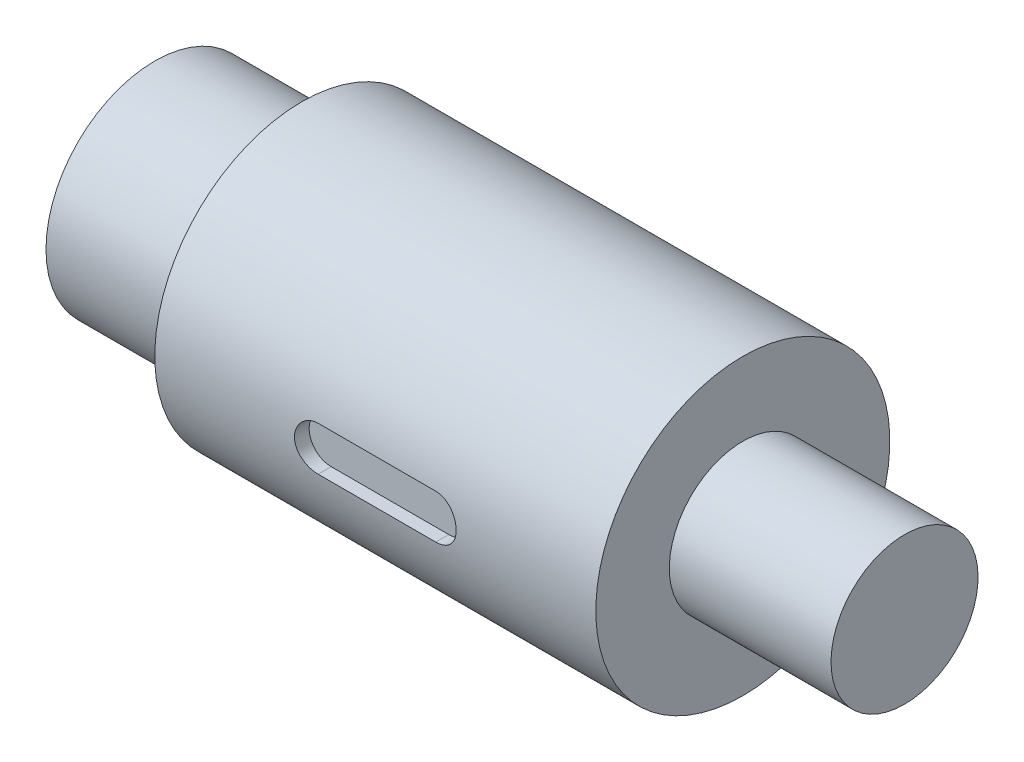
ISO-10303-21;
HEADER;
FILE_DESCRIPTION(('STEP AP214'),'2;1');
FILE_NAME('part.step','',(''),(''),'','','');
FILE_SCHEMA(('AUTOMOTIVE_DESIGN { 1 0 10303 214 1 1 1 1 }'));
ENDSEC;
DATA;
#1=APPLICATION_CONTEXT('core data for automotive mechanical design processes');
#2=APPLICATION_PROTOCOL_DEFINITION('international standard','automotive_design',2000,#1);
#3=PRODUCT_CONTEXT('',#1,'mechanical');
#4=PRODUCT('Part','Part','',(#3));
#5=PRODUCT_RELATED_PRODUCT_CATEGORY('part','',(#4));
#6=PRODUCT_DEFINITION_FORMATION('','',#4);
#7=PRODUCT_DEFINITION_CONTEXT('part definition',#1,'design');
#8=PRODUCT_DEFINITION('design','',#6,#7);
#9=PRODUCT_DEFINITION_SHAPE('','',#8);
#10=(LENGTH_UNIT() NAMED_UNIT(*) SI_UNIT(.MILLI.,.METRE.));
#11=(NAMED_UNIT(*) PLANE_ANGLE_UNIT() SI_UNIT($,.RADIAN.));
#12=(NAMED_UNIT(*) SI_UNIT($,.STERADIAN.) SOLID_ANGLE_UNIT());
#13=UNCERTAINTY_MEASURE_WITH_UNIT(LENGTH_MEASURE(1.E-05),#10,'distance_accuracy_value','');
#14=(GEOMETRIC_REPRESENTATION_CONTEXT(3) GLOBAL_UNCERTAINTY_ASSIGNED_CONTEXT((#13)) GLOBAL_UNIT_ASSIGNED_CONTEXT((#10,
#11,#12)) REPRESENTATION_CONTEXT('',''));
#15=CARTESIAN_POINT('',(0.,0.,0.));
#16=DIRECTION('',(0.,0.,1.));
#17=DIRECTION('',(1.,0.,0.));
#18=AXIS2_PLACEMENT_3D('',#15,#16,#17);
#19=CARTESIAN_POINT('',(0.,0.,0.));
#20=DIRECTION('',(-1.,0.,0.));
#21=DIRECTION('',(0.,-1.,0.));
#22=AXIS2_PLACEMENT_3D('',#19,#20,#21);
#23=CYLINDRICAL_SURFACE('',#22,10.);
#24=CARTESIAN_POINT('',(40.,0.,0.));
#25=DIRECTION('',(-1.,0.,0.));
#26=DIRECTION('',(0.,-1.,0.));
#27=AXIS2_PLACEMENT_3D('',#24,#25,#26);
#28=CIRCLE('',#27,10.);
#29=CARTESIAN_POINT('',(40.,-10.,0.));
#30=VERTEX_POINT('',#29);
#31=EDGE_CURVE('E133',#30,#30,#28,.T.);
#32=ORIENTED_EDGE('',*,*,#31,.T.);
#33=EDGE_LOOP('',(#32));
#34=FACE_BOUND('',#33,.T.);
#35=CARTESIAN_POINT('',(10.,0.,0.));
#36=DIRECTION('',(-1.,0.,0.));
#37=DIRECTION('',(0.,-1.,0.));
#38=AXIS2_PLACEMENT_3D('',#35,#36,#37);
#39=CIRCLE('',#38,10.);
#40=CARTESIAN_POINT('',(10.,-10.,0.));
#41=VERTEX_POINT('',#40);
#42=EDGE_CURVE('E137',#41,#41,#39,.T.);
#43=ORIENTED_EDGE('',*,*,#42,.F.);
#44=EDGE_LOOP('',(#43));
#45=FACE_BOUND('',#44,.T.);
#46=CARTESIAN_POINT('',(21.,1.5,9.88685996664259));
#47=CARTESIAN_POINT('',(20.9580518202284,1.50000000266732,9.88685840785077));
#48=CARTESIAN_POINT('',(20.9161239716696,1.49823923973863,9.88712727473813));
#49=CARTESIAN_POINT('',(20.8325729919536,1.49121669464497,9.88818949187884));
#50=CARTESIAN_POINT('',(20.7909498337063,1.48595522764718,9.88898279491733));
#51=CARTESIAN_POINT('',(20.6670918819678,1.46497881750098,9.89212058297808));
#52=CARTESIAN_POINT('',(20.5856941728406,1.44407166865904,9.89522307907874));
#53=CARTESIAN_POINT('',(20.4276160400256,1.38902615352525,9.90309898933595));
#54=CARTESIAN_POINT('',(20.3509368797062,1.35488426140282,9.90787284872281));
#55=CARTESIAN_POINT('',(20.2043846840671,1.27435597412008,9.91855133175475));
#56=CARTESIAN_POINT('',(20.1345114690497,1.22796990236328,9.92445592553278));
#57=CARTESIAN_POINT('',(20.003018343427,1.12388153164428,9.93678257695107));
#58=CARTESIAN_POINT('',(19.9414601330534,1.06610171081972,9.94320799119173));
#59=CARTESIAN_POINT('',(19.8288678084724,0.941026215278604,9.95582307783248));
#60=CARTESIAN_POINT('',(19.7778353026265,0.873729088931482,9.9620127140873));
#61=CARTESIAN_POINT('',(19.6875219740596,0.731134276552847,9.97349364061962));
#62=CARTESIAN_POINT('',(19.6482985520619,0.655799848412228,9.9787804905557));
#63=CARTESIAN_POINT('',(19.5830869108457,0.499524151714074,9.98782228654626));
#64=CARTESIAN_POINT('',(19.5570972267437,0.418583504853573,9.991577402144));
#65=CARTESIAN_POINT('',(19.5192768330848,0.254032109539508,9.99710911461993));
#66=CARTESIAN_POINT('',(19.5073415576171,0.170445893373183,9.99890031620178));
#67=CARTESIAN_POINT('',(19.4976440141637,0.00243723131435115,10.0003524554738));
#68=CARTESIAN_POINT('',(19.4998812975124,-0.0819851880217101,10.0000134606003));
#69=CARTESIAN_POINT('',(19.5183833632824,-0.248551967983507,9.99725499253034));
#70=CARTESIAN_POINT('',(19.5345352628208,-0.330709184196646,9.99485226193999));
#71=CARTESIAN_POINT('',(19.5802307890995,-0.491133297591266,9.98825497732616));
#72=CARTESIAN_POINT('',(19.6097746805602,-0.569400117837079,9.98406038788298));
#73=CARTESIAN_POINT('',(19.6815316823409,-0.720165267893389,9.97432184229562));
#74=CARTESIAN_POINT('',(19.7237925463523,-0.792640528207519,9.96877281518181));
#75=CARTESIAN_POINT('',(19.8197474036781,-0.929510459057296,9.95694413507246));
#76=CARTESIAN_POINT('',(19.8734416995637,-0.993904915673109,9.95066446274332));
#77=CARTESIAN_POINT('',(19.9913597147132,-1.11344594750422,9.93800248160563));
#78=CARTESIAN_POINT('',(20.0556806240439,-1.16849664126589,9.93161976829432));
#79=CARTESIAN_POINT('',(20.1927216143761,-1.26705366225889,9.9195286802005));
#80=CARTESIAN_POINT('',(20.2654441214946,-1.31055664285508,9.91382050116966));
#81=CARTESIAN_POINT('',(20.41733398012,-1.38479611633514,9.90372408744827));
#82=CARTESIAN_POINT('',(20.4965099305947,-1.41551523132484,9.89933765170366));
#83=CARTESIAN_POINT('',(20.6589222567288,-1.46314856731708,9.89241049501753));
#84=CARTESIAN_POINT('',(20.7421523456687,-1.48008348376203,9.88986700772656));
#85=CARTESIAN_POINT('',(20.8550006632408,-1.49326003326035,9.88788045186338));
#86=CARTESIAN_POINT('',(20.8839672253027,-1.49578864223619,9.88749808040955));
#87=CARTESIAN_POINT('',(20.9419516924164,-1.49915639690531,9.88698811323233));
#88=CARTESIAN_POINT('',(20.9709694287001,-1.49999838230593,9.88686008927622));
#89=CARTESIAN_POINT('',(21.,-1.5,9.88685996664259));
#90=B_SPLINE_CURVE_WITH_KNOTS('',3,(#46,#47,#48,#49,#50,#51,#52,#53,#54,#55,#56,#57,#58,#59,#60,
#61,#62,#63,#64,#65,#66,#67,#68,#69,#70,#71,#72,#73,#74,#75,#76,#77,#78,#79,#80,#81,#82,#83,#84,
#85,#86,#87,#88,#89),.UNSPECIFIED.,.F.,.F.,(4,2,2,2,2,2,2,2,2,2,2,2,2,2,2,2,2,2,2,2,2,4),(0.,
0.125766490239527,0.251521659296977,0.502515401757197,0.753576056756899,1.00463008119644,
1.25745516590775,1.51031885453268,1.76439250557207,2.01843802629312,2.27058124023081,
2.52271647202458,2.77282530444896,3.02293908100775,3.27400403904697,3.52507564202535,
3.77858546479491,4.03216867706423,4.28609548338277,4.53964033991603,4.62684087345504,
4.7138944667809),.UNSPECIFIED.);
#91=CARTESIAN_POINT('',(21.,1.5,9.88685996664259));
#92=VERTEX_POINT('',#91);
#93=CARTESIAN_POINT('',(21.,-1.5,9.88685996664259));
#94=VERTEX_POINT('',#93);
#95=EDGE_CURVE('E11',#92,#94,#90,.T.);
#96=ORIENTED_EDGE('',*,*,#95,.F.);
#97=DIRECTION('',(-1.,0.,0.));
#98=VECTOR('',#97,1.);
#99=CARTESIAN_POINT('',(0.,1.5,9.88685996664259));
#100=LINE('',#99,#98);
#101=CARTESIAN_POINT('',(29.,1.5,9.88685996664259));
#102=VERTEX_POINT('',#101);
#103=EDGE_CURVE('E149',#102,#92,#100,.T.);
#104=ORIENTED_EDGE('',*,*,#103,.F.);
#105=CARTESIAN_POINT('',(29.,-1.5,9.88685996664259));
#106=CARTESIAN_POINT('',(29.0419481797716,-1.50000000266732,9.88685840785077));
#107=CARTESIAN_POINT('',(29.0838760283304,-1.49823923973863,9.88712727473813));
#108=CARTESIAN_POINT('',(29.1674270080464,-1.49121669464497,9.88818949187884));
#109=CARTESIAN_POINT('',(29.2090501662937,-1.48595522764718,9.88898279491733));
#110=CARTESIAN_POINT('',(29.3329081180322,-1.46497881750098,9.89212058297808));
#111=CARTESIAN_POINT('',(29.4143058271594,-1.44407166865905,9.89522307907874));
#112=CARTESIAN_POINT('',(29.5723839599744,-1.38902615352525,9.90309898933595));
#113=CARTESIAN_POINT('',(29.6490631202938,-1.35488426140282,9.90787284872281));
#114=CARTESIAN_POINT('',(29.7956153159329,-1.27435597412008,9.91855133175475));
#115=CARTESIAN_POINT('',(29.8654885309503,-1.22796990236328,9.92445592553278));
#116=CARTESIAN_POINT('',(29.996981656573,-1.12388153164428,9.93678257695107));
#117=CARTESIAN_POINT('',(30.0585398669466,-1.06610171081972,9.94320799119173));
#118=CARTESIAN_POINT('',(30.1711321915276,-0.941026215278605,9.95582307783248));
#119=CARTESIAN_POINT('',(30.2221646973735,-0.873729088931482,9.9620127140873));
#120=CARTESIAN_POINT('',(30.3124780259404,-0.731134276552847,9.97349364061962));
#121=CARTESIAN_POINT('',(30.3517014479381,-0.655799848412228,9.9787804905557));
#122=CARTESIAN_POINT('',(30.4169130891543,-0.499524151714073,9.98782228654626));
#123=CARTESIAN_POINT('',(30.4429027732563,-0.418583504853573,9.991577402144));
#124=CARTESIAN_POINT('',(30.4807231669152,-0.254032109539508,9.99710911461993));
#125=CARTESIAN_POINT('',(30.4926584423829,-0.170445893373183,9.99890031620178));
#126=CARTESIAN_POINT('',(30.5023559858363,-0.00243723131435101,10.0003524554738));
#127=CARTESIAN_POINT('',(30.5001187024876,0.0819851880217102,10.0000134606003));
#128=CARTESIAN_POINT('',(30.4816166367176,0.248551967983507,9.99725499253034));
#129=CARTESIAN_POINT('',(30.4654647371792,0.330709184196646,9.99485226193999));
#130=CARTESIAN_POINT('',(30.4197692109005,0.491133297591266,9.98825497732616));
#131=CARTESIAN_POINT('',(30.3902253194398,0.56940011783708,9.98406038788298));
#132=CARTESIAN_POINT('',(30.3184683176591,0.720165267893389,9.97432184229562));
#133=CARTESIAN_POINT('',(30.2762074536477,0.79264052820752,9.96877281518181));
#134=CARTESIAN_POINT('',(30.1802525963219,0.929510459057296,9.95694413507246));
#135=CARTESIAN_POINT('',(30.1265583004363,0.993904915673109,9.95066446274332));
#136=CARTESIAN_POINT('',(30.0086402852868,1.11344594750422,9.93800248160563));
#137=CARTESIAN_POINT('',(29.9443193759561,1.16849664126589,9.93161976829432));
#138=CARTESIAN_POINT('',(29.8072783856239,1.26705366225889,9.9195286802005));
#139=CARTESIAN_POINT('',(29.7345558785054,1.31055664285508,9.91382050116966));
#140=CARTESIAN_POINT('',(29.58266601988,1.38479611633514,9.90372408744827));
#141=CARTESIAN_POINT('',(29.5034900694053,1.41551523132484,9.89933765170366));
#142=CARTESIAN_POINT('',(29.3410777432712,1.46314856731708,9.89241049501753));
#143=CARTESIAN_POINT('',(29.2578476543313,1.48008348376203,9.88986700772656));
#144=CARTESIAN_POINT('',(29.1449993367592,1.49326003326035,9.88788045186338));
#145=CARTESIAN_POINT('',(29.1160327746973,1.49578864223619,9.88749808040955));
#146=CARTESIAN_POINT('',(29.0580483075836,1.49915639690531,9.88698811323233));
#147=CARTESIAN_POINT('',(29.0290305712999,1.49999838230593,9.88686008927622));
#148=CARTESIAN_POINT('',(29.,1.5,9.88685996664259));
#149=B_SPLINE_CURVE_WITH_KNOTS('',3,(#105,#106,#107,#108,#109,#110,#111,#112,#113,#114,#115,
#116,#117,#118,#119,#120,#121,#122,#123,#124,#125,#126,#127,#128,#129,#130,#131,#132,#133,#134,
#135,#136,#137,#138,#139,#140,#141,#142,#143,#144,#145,#146,#147,#148),.UNSPECIFIED.,.F.,.F.,(4,
2,2,2,2,2,2,2,2,2,2,2,2,2,2,2,2,2,2,2,2,4),(0.,0.125766490239527,0.251521659296974,
0.502515401757197,0.753576056756899,1.00463008119644,1.25745516590774,1.51031885453268,
1.76439250557207,2.01843802629312,2.27058124023081,2.52271647202458,2.77282530444896,
3.02293908100775,3.27400403904697,3.52507564202535,3.77858546479491,4.03216867706422,
4.28609548338277,4.53964033991603,4.62684087345504,4.71389446678089),.UNSPECIFIED.);
#150=CARTESIAN_POINT('',(29.,-1.5,9.88685996664259));
#151=VERTEX_POINT('',#150);
#152=EDGE_CURVE('E152',#151,#102,#149,.T.);
#153=ORIENTED_EDGE('',*,*,#152,.F.);
#154=DIRECTION('',(-1.,0.,0.));
#155=VECTOR('',#154,1.);
#156=CARTESIAN_POINT('',(0.,-1.5,9.88685996664259));
#157=LINE('',#156,#155);
#158=EDGE_CURVE('E58',#94,#151,#157,.F.);
#159=ORIENTED_EDGE('',*,*,#158,.F.);
#160=EDGE_LOOP('',(#96,#104,#153,#159));
#161=FACE_BOUND('',#160,.T.);
#162=ADVANCED_FACE('F43',(#34,#45,#161),#23,.T.);
#163=CARTESIAN_POINT('',(0.,0.,0.));
#164=DIRECTION('',(1.,0.,0.));
#165=DIRECTION('',(0.,1.,0.));
#166=AXIS2_PLACEMENT_3D('',#163,#164,#165);
#167=PLANE('',#166);
#168=CARTESIAN_POINT('',(0.,0.,0.));
#169=DIRECTION('',(-1.,0.,0.));
#170=DIRECTION('',(0.,-1.,0.));
#171=AXIS2_PLACEMENT_3D('',#168,#169,#170);
#172=CIRCLE('',#171,7.4);
#173=CARTESIAN_POINT('',(0.,-7.4,0.));
#174=VERTEX_POINT('',#173);
#175=EDGE_CURVE('E145',#174,#174,#172,.T.);
#176=ORIENTED_EDGE('',*,*,#175,.T.);
#177=EDGE_LOOP('',(#176));
#178=FACE_BOUND('',#177,.T.);
#179=ADVANCED_FACE('F45',(#178),#167,.F.);
#180=CARTESIAN_POINT('',(0.,0.,0.));
#181=DIRECTION('',(-1.,0.,0.));
#182=DIRECTION('',(0.,-1.,0.));
#183=AXIS2_PLACEMENT_3D('',#180,#181,#182);
#184=CYLINDRICAL_SURFACE('',#183,7.4);
#185=ORIENTED_EDGE('',*,*,#175,.F.);
#186=EDGE_LOOP('',(#185));
#187=FACE_BOUND('',#186,.T.);
#188=CARTESIAN_POINT('',(10.,0.,0.));
#189=DIRECTION('',(-1.,0.,0.));
#190=DIRECTION('',(0.,-1.,0.));
#191=AXIS2_PLACEMENT_3D('',#188,#189,#190);
#192=CIRCLE('',#191,7.4);
#193=CARTESIAN_POINT('',(10.,-7.4,0.));
#194=VERTEX_POINT('',#193);
#195=EDGE_CURVE('E141',#194,#194,#192,.T.);
#196=ORIENTED_EDGE('',*,*,#195,.T.);
#197=EDGE_LOOP('',(#196));
#198=FACE_BOUND('',#197,.T.);
#199=ADVANCED_FACE('F188',(#187,#198),#184,.T.);
#200=CARTESIAN_POINT('',(10.,7.4,0.));
#201=DIRECTION('',(1.,0.,0.));
#202=DIRECTION('',(0.,1.,0.));
#203=AXIS2_PLACEMENT_3D('',#200,#201,#202);
#204=PLANE('',#203);
#205=ORIENTED_EDGE('',*,*,#195,.F.);
#206=EDGE_LOOP('',(#205));
#207=FACE_BOUND('',#206,.T.);
#208=ORIENTED_EDGE('',*,*,#42,.T.);
#209=EDGE_LOOP('',(#208));
#210=FACE_BOUND('',#209,.T.);
#211=ADVANCED_FACE('F183',(#207,#210),#204,.F.);
#212=CARTESIAN_POINT('',(40.,10.,0.));
#213=DIRECTION('',(-1.,0.,0.));
#214=DIRECTION('',(0.,-1.,0.));
#215=AXIS2_PLACEMENT_3D('',#212,#213,#214);
#216=PLANE('',#215);
#217=ORIENTED_EDGE('',*,*,#31,.F.);
#218=EDGE_LOOP('',(#217));
#219=FACE_BOUND('',#218,.T.);
#220=CARTESIAN_POINT('',(40.,0.,0.));
#221=DIRECTION('',(-1.,0.,0.));
#222=DIRECTION('',(0.,-1.,0.));
#223=AXIS2_PLACEMENT_3D('',#220,#221,#222);
#224=CIRCLE('',#223,5.);
#225=CARTESIAN_POINT('',(40.,-5.,0.));
#226=VERTEX_POINT('',#225);
#227=EDGE_CURVE('E129',#226,#226,#224,.T.);
#228=ORIENTED_EDGE('',*,*,#227,.T.);
#229=EDGE_LOOP('',(#228));
#230=FACE_BOUND('',#229,.T.);
#231=ADVANCED_FACE('F180',(#219,#230),#216,.F.);
#232=CARTESIAN_POINT('',(0.,0.,0.));
#233=DIRECTION('',(-1.,0.,0.));
#234=DIRECTION('',(0.,-1.,0.));
#235=AXIS2_PLACEMENT_3D('',#232,#233,#234);
#236=CYLINDRICAL_SURFACE('',#235,5.);
#237=ORIENTED_EDGE('',*,*,#227,.F.);
#238=EDGE_LOOP('',(#237));
#239=FACE_BOUND('',#238,.T.);
#240=CARTESIAN_POINT('',(51.,0.,0.));
#241=DIRECTION('',(-1.,0.,0.));
#242=DIRECTION('',(0.,-1.,0.));
#243=AXIS2_PLACEMENT_3D('',#240,#241,#242);
#244=CIRCLE('',#243,5.);
#245=CARTESIAN_POINT('',(51.,-5.,0.));
#246=VERTEX_POINT('',#245);
#247=EDGE_CURVE('E96',#246,#246,#244,.T.);
#248=ORIENTED_EDGE('',*,*,#247,.T.);
#249=EDGE_LOOP('',(#248));
#250=FACE_BOUND('',#249,.T.);
#251=ADVANCED_FACE('F177',(#239,#250),#236,.T.);
#252=CARTESIAN_POINT('',(51.,5.,0.));
#253=DIRECTION('',(-1.,0.,0.));
#254=DIRECTION('',(0.,-1.,0.));
#255=AXIS2_PLACEMENT_3D('',#252,#253,#254);
#256=PLANE('',#255);
#257=ORIENTED_EDGE('',*,*,#247,.F.);
#258=EDGE_LOOP('',(#257));
#259=FACE_BOUND('',#258,.T.);
#260=ADVANCED_FACE('F174',(#259),#256,.F.);
#261=CARTESIAN_POINT('',(21.,0.,19.));
#262=DIRECTION('',(0.,0.,-1.));
#263=DIRECTION('',(-1.,0.,0.));
#264=AXIS2_PLACEMENT_3D('',#261,#262,#263);
#265=CYLINDRICAL_SURFACE('',#264,1.5);
#266=ORIENTED_EDGE('',*,*,#95,.T.);
#267=DIRECTION('',(0.,0.,-1.));
#268=VECTOR('',#267,1.);
#269=CARTESIAN_POINT('',(21.,-1.5,19.));
#270=LINE('',#269,#268);
#271=CARTESIAN_POINT('',(21.,-1.5,9.));
#272=VERTEX_POINT('',#271);
#273=EDGE_CURVE('E88',#94,#272,#270,.T.);
#274=ORIENTED_EDGE('',*,*,#273,.T.);
#275=CARTESIAN_POINT('',(21.,0.,9.));
#276=DIRECTION('',(0.,0.,1.));
#277=DIRECTION('',(1.,0.,0.));
#278=AXIS2_PLACEMENT_3D('',#275,#276,#277);
#279=CIRCLE('',#278,1.5);
#280=CARTESIAN_POINT('',(21.,1.5,9.));
#281=VERTEX_POINT('',#280);
#282=EDGE_CURVE('E92',#281,#272,#279,.T.);
#283=ORIENTED_EDGE('',*,*,#282,.F.);
#284=DIRECTION('',(0.,0.,-1.));
#285=VECTOR('',#284,1.);
#286=CARTESIAN_POINT('',(21.,1.5,19.));
#287=LINE('',#286,#285);
#288=EDGE_CURVE('E119',#92,#281,#287,.T.);
#289=ORIENTED_EDGE('',*,*,#288,.F.);
#290=EDGE_LOOP('',(#266,#274,#283,#289));
#291=FACE_BOUND('',#290,.T.);
#292=ADVANCED_FACE('F90',(#291),#265,.F.);
#293=CARTESIAN_POINT('',(21.,-1.5,19.));
#294=DIRECTION('',(0.,1.,0.));
#295=DIRECTION('',(0.,0.,1.));
#296=AXIS2_PLACEMENT_3D('',#293,#294,#295);
#297=PLANE('',#296);
#298=ORIENTED_EDGE('',*,*,#158,.T.);
#299=DIRECTION('',(0.,0.,-1.));
#300=VECTOR('',#299,1.);
#301=CARTESIAN_POINT('',(29.,-1.5,19.));
#302=LINE('',#301,#300);
#303=CARTESIAN_POINT('',(29.,-1.5,9.));
#304=VERTEX_POINT('',#303);
#305=EDGE_CURVE('E97',#151,#304,#302,.T.);
#306=ORIENTED_EDGE('',*,*,#305,.T.);
#307=DIRECTION('',(1.,0.,0.));
#308=VECTOR('',#307,1.);
#309=CARTESIAN_POINT('',(21.,-1.5,9.));
#310=LINE('',#309,#308);
#311=EDGE_CURVE('E100',#272,#304,#310,.T.);
#312=ORIENTED_EDGE('',*,*,#311,.F.);
#313=ORIENTED_EDGE('',*,*,#273,.F.);
#314=EDGE_LOOP('',(#298,#306,#312,#313));
#315=FACE_BOUND('',#314,.T.);
#316=ADVANCED_FACE('F101',(#315),#297,.T.);
#317=CARTESIAN_POINT('',(29.,0.,19.));
#318=DIRECTION('',(0.,0.,-1.));
#319=DIRECTION('',(-1.,0.,0.));
#320=AXIS2_PLACEMENT_3D('',#317,#318,#319);
#321=CYLINDRICAL_SURFACE('',#320,1.5);
#322=ORIENTED_EDGE('',*,*,#152,.T.);
#323=DIRECTION('',(0.,0.,-1.));
#324=VECTOR('',#323,1.);
#325=CARTESIAN_POINT('',(29.,1.5,19.));
#326=LINE('',#325,#324);
#327=CARTESIAN_POINT('',(29.,1.5,9.));
#328=VERTEX_POINT('',#327);
#329=EDGE_CURVE('E65',#102,#328,#326,.T.);
#330=ORIENTED_EDGE('',*,*,#329,.T.);
#331=CARTESIAN_POINT('',(29.,0.,9.));
#332=DIRECTION('',(0.,0.,1.));
#333=DIRECTION('',(1.,0.,0.));
#334=AXIS2_PLACEMENT_3D('',#331,#332,#333);
#335=CIRCLE('',#334,1.5);
#336=EDGE_CURVE('E107',#304,#328,#335,.T.);
#337=ORIENTED_EDGE('',*,*,#336,.F.);
#338=ORIENTED_EDGE('',*,*,#305,.F.);
#339=EDGE_LOOP('',(#322,#330,#337,#338));
#340=FACE_BOUND('',#339,.T.);
#341=ADVANCED_FACE('F162',(#340),#321,.F.);
#342=CARTESIAN_POINT('',(21.,1.5,19.));
#343=DIRECTION('',(0.,-1.,0.));
#344=DIRECTION('',(0.,0.,-1.));
#345=AXIS2_PLACEMENT_3D('',#342,#343,#344);
#346=PLANE('',#345);
#347=ORIENTED_EDGE('',*,*,#103,.T.);
#348=ORIENTED_EDGE('',*,*,#288,.T.);
#349=DIRECTION('',(-1.,0.,0.));
#350=VECTOR('',#349,1.);
#351=CARTESIAN_POINT('',(21.,1.5,9.));
#352=LINE('',#351,#350);
#353=EDGE_CURVE('E111',#328,#281,#352,.T.);
#354=ORIENTED_EDGE('',*,*,#353,.F.);
#355=ORIENTED_EDGE('',*,*,#329,.F.);
#356=EDGE_LOOP('',(#347,#348,#354,#355));
#357=FACE_BOUND('',#356,.T.);
#358=ADVANCED_FACE('F167',(#357),#346,.T.);
#359=CARTESIAN_POINT('',(21.,0.,9.));
#360=DIRECTION('',(0.,0.,1.));
#361=DIRECTION('',(1.,0.,0.));
#362=AXIS2_PLACEMENT_3D('',#359,#360,#361);
#363=PLANE('',#362);
#364=ORIENTED_EDGE('',*,*,#282,.T.);
#365=ORIENTED_EDGE('',*,*,#311,.T.);
#366=ORIENTED_EDGE('',*,*,#336,.T.);
#367=ORIENTED_EDGE('',*,*,#353,.T.);
#368=EDGE_LOOP('',(#364,#365,#366,#367));
#369=FACE_BOUND('',#368,.T.);
#370=ADVANCED_FACE('F110',(#369),#363,.T.);
#371=CLOSED_SHELL('',(#162,#179,#199,#211,#231,#251,#260,#292,#316,#341,#358,#370));
#372=MANIFOLD_SOLID_BREP('B2',#371);
#373=ADVANCED_BREP_SHAPE_REPRESENTATION('',(#18,#372),#14);
#374=SHAPE_DEFINITION_REPRESENTATION(#9,#373);
ENDSEC;
END-ISO-10303-21;
